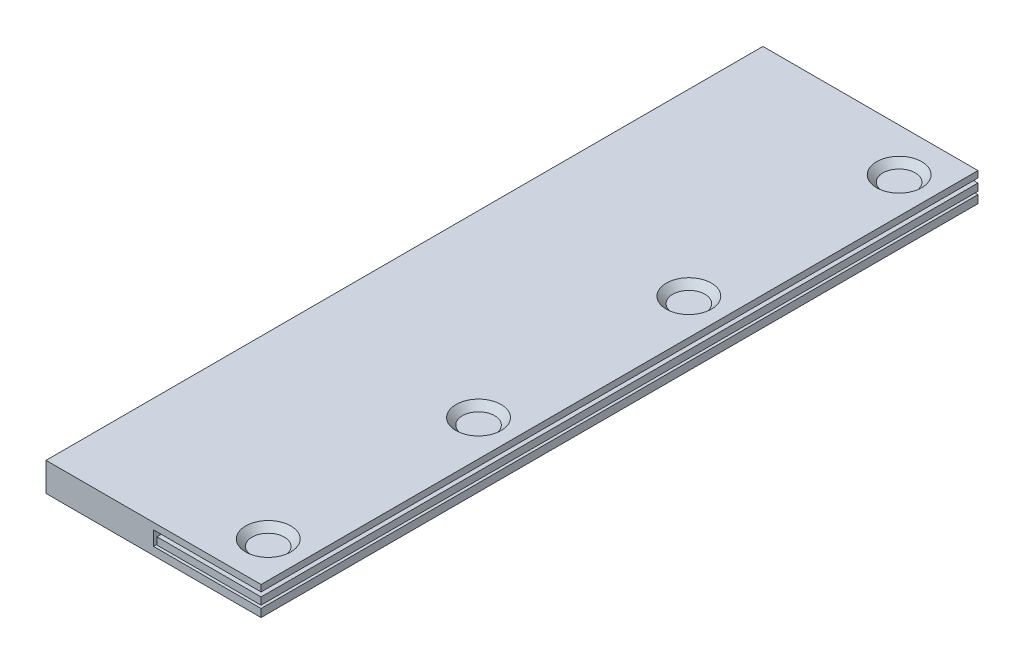
ISO-10303-21;
HEADER;
FILE_DESCRIPTION(('STEP AP214'),'2;1');
FILE_NAME('part.step','',(''),(''),'','','');
FILE_SCHEMA(('AUTOMOTIVE_DESIGN { 1 0 10303 214 1 1 1 1 }'));
ENDSEC;
DATA;
#1=APPLICATION_CONTEXT('core data for automotive mechanical design processes');
#2=APPLICATION_PROTOCOL_DEFINITION('international standard','automotive_design',2000,#1);
#3=PRODUCT_CONTEXT('',#1,'mechanical');
#4=PRODUCT('Part','Part','',(#3));
#5=PRODUCT_RELATED_PRODUCT_CATEGORY('part','',(#4));
#6=PRODUCT_DEFINITION_FORMATION('','',#4);
#7=PRODUCT_DEFINITION_CONTEXT('part definition',#1,'design');
#8=PRODUCT_DEFINITION('design','',#6,#7);
#9=PRODUCT_DEFINITION_SHAPE('','',#8);
#10=(LENGTH_UNIT() NAMED_UNIT(*) SI_UNIT(.MILLI.,.METRE.));
#11=(NAMED_UNIT(*) PLANE_ANGLE_UNIT() SI_UNIT($,.RADIAN.));
#12=(NAMED_UNIT(*) SI_UNIT($,.STERADIAN.) SOLID_ANGLE_UNIT());
#13=UNCERTAINTY_MEASURE_WITH_UNIT(LENGTH_MEASURE(1.E-05),#10,'distance_accuracy_value','');
#14=(GEOMETRIC_REPRESENTATION_CONTEXT(3) GLOBAL_UNCERTAINTY_ASSIGNED_CONTEXT((#13)) GLOBAL_UNIT_ASSIGNED_CONTEXT((#10,
#11,#12)) REPRESENTATION_CONTEXT('',''));
#15=CARTESIAN_POINT('',(0.,0.,0.));
#16=DIRECTION('',(0.,0.,1.));
#17=DIRECTION('',(1.,0.,0.));
#18=AXIS2_PLACEMENT_3D('',#15,#16,#17);
#19=CARTESIAN_POINT('',(0.,104.148653627844,0.));
#20=DIRECTION('',(-1.,0.,0.));
#21=DIRECTION('',(0.,-1.,0.));
#22=AXIS2_PLACEMENT_3D('',#19,#20,#21);
#23=PLANE('',#22);
#24=DIRECTION('',(0.,0.,-1.));
#25=VECTOR('',#24,1.);
#26=CARTESIAN_POINT('',(0.,2.5,0.));
#27=LINE('',#26,#25);
#28=CARTESIAN_POINT('',(0.,2.5,100.));
#29=VERTEX_POINT('',#28);
#30=CARTESIAN_POINT('',(0.,2.5,0.));
#31=VERTEX_POINT('',#30);
#32=EDGE_CURVE('E103',#29,#31,#27,.T.);
#33=ORIENTED_EDGE('',*,*,#32,.F.);
#34=DIRECTION('',(0.,-1.,0.));
#35=VECTOR('',#34,1.);
#36=CARTESIAN_POINT('',(0.,104.148653627844,100.));
#37=LINE('',#36,#35);
#38=CARTESIAN_POINT('',(0.,1.5,100.));
#39=VERTEX_POINT('',#38);
#40=EDGE_CURVE('E57',#29,#39,#37,.T.);
#41=ORIENTED_EDGE('',*,*,#40,.T.);
#42=DIRECTION('',(0.,0.,-1.));
#43=VECTOR('',#42,1.);
#44=CARTESIAN_POINT('',(0.,1.5,0.));
#45=LINE('',#44,#43);
#46=CARTESIAN_POINT('',(0.,1.5,0.));
#47=VERTEX_POINT('',#46);
#48=EDGE_CURVE('E101',#39,#47,#45,.T.);
#49=ORIENTED_EDGE('',*,*,#48,.T.);
#50=DIRECTION('',(0.,-1.,0.));
#51=VECTOR('',#50,1.);
#52=CARTESIAN_POINT('',(0.,104.148653627844,0.));
#53=LINE('',#52,#51);
#54=EDGE_CURVE('E92',#31,#47,#53,.T.);
#55=ORIENTED_EDGE('',*,*,#54,.F.);
#56=EDGE_LOOP('',(#33,#41,#49,#55));
#57=FACE_BOUND('',#56,.T.);
#58=ADVANCED_FACE('F53',(#57),#23,.F.);
#59=CARTESIAN_POINT('',(0.,104.148653627844,0.));
#60=DIRECTION('',(0.,0.,1.));
#61=DIRECTION('',(1.,0.,0.));
#62=AXIS2_PLACEMENT_3D('',#59,#60,#61);
#63=PLANE('',#62);
#64=DIRECTION('',(-1.,0.,0.));
#65=VECTOR('',#64,1.);
#66=CARTESIAN_POINT('',(0.,2.5,0.));
#67=LINE('',#66,#65);
#68=CARTESIAN_POINT('',(-14.52,2.5,0.));
#69=VERTEX_POINT('',#68);
#70=EDGE_CURVE('E62',#31,#69,#67,.T.);
#71=ORIENTED_EDGE('',*,*,#70,.F.);
#72=ORIENTED_EDGE('',*,*,#54,.T.);
#73=DIRECTION('',(-1.,0.,0.));
#74=VECTOR('',#73,1.);
#75=CARTESIAN_POINT('',(0.,1.5,0.));
#76=LINE('',#75,#74);
#77=CARTESIAN_POINT('',(-14.52,1.5,0.));
#78=VERTEX_POINT('',#77);
#79=EDGE_CURVE('E113',#47,#78,#76,.T.);
#80=ORIENTED_EDGE('',*,*,#79,.T.);
#81=DIRECTION('',(0.,-1.,0.));
#82=VECTOR('',#81,1.);
#83=CARTESIAN_POINT('',(-14.52,104.148653627844,0.));
#84=LINE('',#83,#82);
#85=EDGE_CURVE('E122',#69,#78,#84,.T.);
#86=ORIENTED_EDGE('',*,*,#85,.F.);
#87=EDGE_LOOP('',(#71,#72,#80,#86));
#88=FACE_BOUND('',#87,.T.);
#89=ADVANCED_FACE('F126',(#88),#63,.F.);
#90=CARTESIAN_POINT('',(-14.52,104.148653627844,0.));
#91=DIRECTION('',(1.,0.,0.));
#92=DIRECTION('',(0.,1.,0.));
#93=AXIS2_PLACEMENT_3D('',#90,#91,#92);
#94=PLANE('',#93);
#95=DIRECTION('',(0.,0.,1.));
#96=VECTOR('',#95,1.);
#97=CARTESIAN_POINT('',(-14.52,2.5,0.));
#98=LINE('',#97,#96);
#99=CARTESIAN_POINT('',(-14.52,2.5,100.));
#100=VERTEX_POINT('',#99);
#101=EDGE_CURVE('E13',#69,#100,#98,.T.);
#102=ORIENTED_EDGE('',*,*,#101,.F.);
#103=ORIENTED_EDGE('',*,*,#85,.T.);
#104=DIRECTION('',(0.,0.,1.));
#105=VECTOR('',#104,1.);
#106=CARTESIAN_POINT('',(-14.52,1.5,0.));
#107=LINE('',#106,#105);
#108=CARTESIAN_POINT('',(-14.52,1.5,100.));
#109=VERTEX_POINT('',#108);
#110=EDGE_CURVE('E123',#78,#109,#107,.T.);
#111=ORIENTED_EDGE('',*,*,#110,.T.);
#112=DIRECTION('',(0.,-1.,0.));
#113=VECTOR('',#112,1.);
#114=CARTESIAN_POINT('',(-14.52,104.148653627844,100.));
#115=LINE('',#114,#113);
#116=EDGE_CURVE('E75',#100,#109,#115,.T.);
#117=ORIENTED_EDGE('',*,*,#116,.F.);
#118=EDGE_LOOP('',(#102,#103,#111,#117));
#119=FACE_BOUND('',#118,.T.);
#120=ADVANCED_FACE('F125',(#119),#94,.F.);
#121=CARTESIAN_POINT('',(-14.52,104.148653627844,100.));
#122=DIRECTION('',(0.,0.,-1.));
#123=DIRECTION('',(-1.,0.,0.));
#124=AXIS2_PLACEMENT_3D('',#121,#122,#123);
#125=PLANE('',#124);
#126=DIRECTION('',(1.,0.,0.));
#127=VECTOR('',#126,1.);
#128=CARTESIAN_POINT('',(-14.52,2.5,100.));
#129=LINE('',#128,#127);
#130=EDGE_CURVE('E110',#100,#29,#129,.T.);
#131=ORIENTED_EDGE('',*,*,#130,.F.);
#132=ORIENTED_EDGE('',*,*,#116,.T.);
#133=DIRECTION('',(1.,0.,0.));
#134=VECTOR('',#133,1.);
#135=CARTESIAN_POINT('',(-14.52,1.5,100.));
#136=LINE('',#135,#134);
#137=EDGE_CURVE('E106',#109,#39,#136,.T.);
#138=ORIENTED_EDGE('',*,*,#137,.T.);
#139=ORIENTED_EDGE('',*,*,#40,.F.);
#140=EDGE_LOOP('',(#131,#132,#138,#139));
#141=FACE_BOUND('',#140,.T.);
#142=ADVANCED_FACE('F107',(#141),#125,.F.);
#143=CARTESIAN_POINT('',(0.,1.5,0.));
#144=DIRECTION('',(0.,1.,0.));
#145=DIRECTION('',(-1.,0.,0.));
#146=AXIS2_PLACEMENT_3D('',#143,#144,#145);
#147=PLANE('',#146);
#148=ORIENTED_EDGE('',*,*,#48,.F.);
#149=ORIENTED_EDGE('',*,*,#137,.F.);
#150=ORIENTED_EDGE('',*,*,#110,.F.);
#151=ORIENTED_EDGE('',*,*,#79,.F.);
#152=EDGE_LOOP('',(#148,#149,#150,#151));
#153=FACE_BOUND('',#152,.T.);
#154=ADVANCED_FACE('F112',(#153),#147,.F.);
#155=CARTESIAN_POINT('',(-15.,2.5,-15.0013332740793));
#156=DIRECTION('',(0.,1.,0.));
#157=DIRECTION('',(0.,0.,1.));
#158=AXIS2_PLACEMENT_3D('',#155,#156,#157);
#159=PLANE('',#158);
#160=ORIENTED_EDGE('',*,*,#130,.T.);
#161=ORIENTED_EDGE('',*,*,#32,.T.);
#162=ORIENTED_EDGE('',*,*,#70,.T.);
#163=ORIENTED_EDGE('',*,*,#101,.T.);
#164=EDGE_LOOP('',(#160,#161,#162,#163));
#165=FACE_BOUND('',#164,.T.);
#166=ADVANCED_FACE('F55',(#165),#159,.T.);
#167=CLOSED_SHELL('',(#58,#89,#120,#142,#154,#166));
#168=MANIFOLD_SOLID_BREP('B2',#167);
#169=CARTESIAN_POINT('',(-15.,3.1,-15.0013332740793));
#170=DIRECTION('',(0.,1.,0.));
#171=DIRECTION('',(0.,0.,1.));
#172=AXIS2_PLACEMENT_3D('',#169,#170,#171);
#173=PLANE('',#172);
#174=CARTESIAN_POINT('',(-5.,3.1,94.));
#175=DIRECTION('',(0.,1.,0.));
#176=DIRECTION('',(0.,0.,1.));
#177=AXIS2_PLACEMENT_3D('',#174,#175,#176);
#178=CIRCLE('',#177,2.25);
#179=CARTESIAN_POINT('',(-5.,3.1,96.25));
#180=VERTEX_POINT('',#179);
#181=EDGE_CURVE('E458',#180,#180,#178,.F.);
#182=ORIENTED_EDGE('',*,*,#181,.F.);
#183=EDGE_LOOP('',(#182));
#184=FACE_BOUND('',#183,.T.);
#185=DIRECTION('',(1.,0.,0.));
#186=VECTOR('',#185,1.);
#187=CARTESIAN_POINT('',(-15.,3.1,0.));
#188=LINE('',#187,#186);
#189=CARTESIAN_POINT('',(-15.,3.1,0.));
#190=VERTEX_POINT('',#189);
#191=CARTESIAN_POINT('',(0.,3.1,0.));
#192=VERTEX_POINT('',#191);
#193=EDGE_CURVE('E262',#190,#192,#188,.T.);
#194=ORIENTED_EDGE('',*,*,#193,.T.);
#195=DIRECTION('',(0.,0.,1.));
#196=VECTOR('',#195,1.);
#197=CARTESIAN_POINT('',(0.,3.1,-15.0013332740793));
#198=LINE('',#197,#196);
#199=CARTESIAN_POINT('',(0.,3.1,100.));
#200=VERTEX_POINT('',#199);
#201=EDGE_CURVE('E256',#192,#200,#198,.T.);
#202=ORIENTED_EDGE('',*,*,#201,.T.);
#203=DIRECTION('',(-1.,0.,0.));
#204=VECTOR('',#203,1.);
#205=CARTESIAN_POINT('',(-15.,3.1,100.));
#206=LINE('',#205,#204);
#207=CARTESIAN_POINT('',(-15.,3.1,100.));
#208=VERTEX_POINT('',#207);
#209=EDGE_CURVE('E260',#200,#208,#206,.T.);
#210=ORIENTED_EDGE('',*,*,#209,.T.);
#211=DIRECTION('',(0.,0.,1.));
#212=VECTOR('',#211,1.);
#213=CARTESIAN_POINT('',(-15.,3.1,-15.0013332740793));
#214=LINE('',#213,#212);
#215=EDGE_CURVE('E267',#190,#208,#214,.T.);
#216=ORIENTED_EDGE('',*,*,#215,.F.);
#217=EDGE_LOOP('',(#194,#202,#210,#216));
#218=FACE_BOUND('',#217,.T.);
#219=CARTESIAN_POINT('',(-5.,3.1,35.3333333333333));
#220=DIRECTION('',(0.,1.,0.));
#221=DIRECTION('',(0.,0.,1.));
#222=AXIS2_PLACEMENT_3D('',#219,#220,#221);
#223=CIRCLE('',#222,2.25);
#224=CARTESIAN_POINT('',(-5.,3.1,37.5833333333333));
#225=VERTEX_POINT('',#224);
#226=EDGE_CURVE('E278',#225,#225,#223,.F.);
#227=ORIENTED_EDGE('',*,*,#226,.F.);
#228=EDGE_LOOP('',(#227));
#229=FACE_BOUND('',#228,.T.);
#230=CARTESIAN_POINT('',(-5.,3.1,6.));
#231=DIRECTION('',(0.,1.,0.));
#232=DIRECTION('',(0.,0.,1.));
#233=AXIS2_PLACEMENT_3D('',#230,#231,#232);
#234=CIRCLE('',#233,2.25);
#235=CARTESIAN_POINT('',(-5.,3.1,8.25));
#236=VERTEX_POINT('',#235);
#237=EDGE_CURVE('E442',#236,#236,#234,.F.);
#238=ORIENTED_EDGE('',*,*,#237,.F.);
#239=EDGE_LOOP('',(#238));
#240=FACE_BOUND('',#239,.T.);
#241=CARTESIAN_POINT('',(-5.,3.1,64.6666666666667));
#242=DIRECTION('',(0.,1.,0.));
#243=DIRECTION('',(0.,0.,1.));
#244=AXIS2_PLACEMENT_3D('',#241,#242,#243);
#245=CIRCLE('',#244,2.25);
#246=CARTESIAN_POINT('',(-5.,3.1,66.9166666666667));
#247=VERTEX_POINT('',#246);
#248=EDGE_CURVE('E450',#247,#247,#245,.F.);
#249=ORIENTED_EDGE('',*,*,#248,.F.);
#250=EDGE_LOOP('',(#249));
#251=FACE_BOUND('',#250,.T.);
#252=ADVANCED_FACE('F178',(#184,#218,#229,#240,#251),#173,.F.);
#253=CARTESIAN_POINT('',(0.,4.,0.));
#254=DIRECTION('',(-1.,0.,0.));
#255=DIRECTION('',(0.,0.,1.));
#256=AXIS2_PLACEMENT_3D('',#253,#254,#255);
#257=PLANE('',#256);
#258=DIRECTION('',(0.,-1.,0.));
#259=VECTOR('',#258,1.);
#260=CARTESIAN_POINT('',(0.,4.,0.));
#261=LINE('',#260,#259);
#262=CARTESIAN_POINT('',(0.,1.1,0.));
#263=VERTEX_POINT('',#262);
#264=CARTESIAN_POINT('',(0.,0.,0.));
#265=VERTEX_POINT('',#264);
#266=EDGE_CURVE('E188',#263,#265,#261,.T.);
#267=ORIENTED_EDGE('',*,*,#266,.F.);
#268=DIRECTION('',(0.,0.,1.));
#269=VECTOR('',#268,1.);
#270=CARTESIAN_POINT('',(0.,1.1,-0.001000000000001));
#271=LINE('',#270,#269);
#272=CARTESIAN_POINT('',(0.,1.1,100.));
#273=VERTEX_POINT('',#272);
#274=EDGE_CURVE('E311',#263,#273,#271,.T.);
#275=ORIENTED_EDGE('',*,*,#274,.T.);
#276=DIRECTION('',(0.,-1.,0.));
#277=VECTOR('',#276,1.);
#278=CARTESIAN_POINT('',(0.,4.,100.));
#279=LINE('',#278,#277);
#280=CARTESIAN_POINT('',(0.,0.,100.));
#281=VERTEX_POINT('',#280);
#282=EDGE_CURVE('E222',#273,#281,#279,.T.);
#283=ORIENTED_EDGE('',*,*,#282,.T.);
#284=DIRECTION('',(0.,0.,-1.));
#285=VECTOR('',#284,1.);
#286=CARTESIAN_POINT('',(0.,0.,0.));
#287=LINE('',#286,#285);
#288=EDGE_CURVE('E306',#281,#265,#287,.T.);
#289=ORIENTED_EDGE('',*,*,#288,.T.);
#290=EDGE_LOOP('',(#267,#275,#283,#289));
#291=FACE_BOUND('',#290,.T.);
#292=ADVANCED_FACE('F309',(#291),#257,.F.);
#293=CARTESIAN_POINT('',(0.,4.,100.));
#294=VERTEX_POINT('',#293);
#295=EDGE_CURVE('E271',#294,#200,#279,.T.);
#296=ORIENTED_EDGE('',*,*,#295,.T.);
#297=ORIENTED_EDGE('',*,*,#201,.F.);
#298=CARTESIAN_POINT('',(0.,4.,0.));
#299=VERTEX_POINT('',#298);
#300=EDGE_CURVE('E51',#299,#192,#261,.T.);
#301=ORIENTED_EDGE('',*,*,#300,.F.);
#302=DIRECTION('',(0.,0.,-1.));
#303=VECTOR('',#302,1.);
#304=CARTESIAN_POINT('',(0.,4.,0.));
#305=LINE('',#304,#303);
#306=EDGE_CURVE('E280',#294,#299,#305,.T.);
#307=ORIENTED_EDGE('',*,*,#306,.F.);
#308=EDGE_LOOP('',(#296,#297,#301,#307));
#309=FACE_BOUND('',#308,.T.);
#310=ADVANCED_FACE('F180',(#309),#257,.F.);
#311=CARTESIAN_POINT('',(0.,4.,0.));
#312=DIRECTION('',(0.,0.,1.));
#313=DIRECTION('',(1.,0.,0.));
#314=AXIS2_PLACEMENT_3D('',#311,#312,#313);
#315=PLANE('',#314);
#316=ORIENTED_EDGE('',*,*,#193,.F.);
#317=DIRECTION('',(0.,1.,0.));
#318=VECTOR('',#317,1.);
#319=CARTESIAN_POINT('',(-15.,2.9,0.));
#320=LINE('',#319,#318);
#321=CARTESIAN_POINT('',(-15.,1.1,0.));
#322=VERTEX_POINT('',#321);
#323=EDGE_CURVE('E418',#322,#190,#320,.T.);
#324=ORIENTED_EDGE('',*,*,#323,.F.);
#325=DIRECTION('',(-1.,0.,0.));
#326=VECTOR('',#325,1.);
#327=CARTESIAN_POINT('',(0.,1.1,0.));
#328=LINE('',#327,#326);
#329=EDGE_CURVE('E301',#263,#322,#328,.T.);
#330=ORIENTED_EDGE('',*,*,#329,.F.);
#331=ORIENTED_EDGE('',*,*,#266,.T.);
#332=DIRECTION('',(-1.,0.,0.));
#333=VECTOR('',#332,1.);
#334=CARTESIAN_POINT('',(0.,0.,0.));
#335=LINE('',#334,#333);
#336=CARTESIAN_POINT('',(-30.,0.,0.));
#337=VERTEX_POINT('',#336);
#338=EDGE_CURVE('E298',#265,#337,#335,.T.);
#339=ORIENTED_EDGE('',*,*,#338,.T.);
#340=DIRECTION('',(0.,-1.,0.));
#341=VECTOR('',#340,1.);
#342=CARTESIAN_POINT('',(-30.,4.,0.));
#343=LINE('',#342,#341);
#344=CARTESIAN_POINT('',(-30.,4.,0.));
#345=VERTEX_POINT('',#344);
#346=EDGE_CURVE('E286',#345,#337,#343,.T.);
#347=ORIENTED_EDGE('',*,*,#346,.F.);
#348=DIRECTION('',(-1.,0.,0.));
#349=VECTOR('',#348,1.);
#350=CARTESIAN_POINT('',(0.,4.,0.));
#351=LINE('',#350,#349);
#352=EDGE_CURVE('E229',#299,#345,#351,.T.);
#353=ORIENTED_EDGE('',*,*,#352,.F.);
#354=ORIENTED_EDGE('',*,*,#300,.T.);
#355=EDGE_LOOP('',(#316,#324,#330,#331,#339,#347,#353,#354));
#356=FACE_BOUND('',#355,.T.);
#357=ADVANCED_FACE('F297',(#356),#315,.F.);
#358=CARTESIAN_POINT('',(-30.,4.,0.));
#359=DIRECTION('',(1.,0.,0.));
#360=DIRECTION('',(0.,0.,-1.));
#361=AXIS2_PLACEMENT_3D('',#358,#359,#360);
#362=PLANE('',#361);
#363=DIRECTION('',(0.,0.,1.));
#364=VECTOR('',#363,1.);
#365=CARTESIAN_POINT('',(-30.,0.,0.));
#366=LINE('',#365,#364);
#367=CARTESIAN_POINT('',(-30.,0.,100.));
#368=VERTEX_POINT('',#367);
#369=EDGE_CURVE('E214',#337,#368,#366,.T.);
#370=ORIENTED_EDGE('',*,*,#369,.T.);
#371=DIRECTION('',(0.,-1.,0.));
#372=VECTOR('',#371,1.);
#373=CARTESIAN_POINT('',(-30.,4.,100.));
#374=LINE('',#373,#372);
#375=CARTESIAN_POINT('',(-30.,4.,100.));
#376=VERTEX_POINT('',#375);
#377=EDGE_CURVE('E282',#376,#368,#374,.T.);
#378=ORIENTED_EDGE('',*,*,#377,.F.);
#379=DIRECTION('',(0.,0.,1.));
#380=VECTOR('',#379,1.);
#381=CARTESIAN_POINT('',(-30.,4.,0.));
#382=LINE('',#381,#380);
#383=EDGE_CURVE('E323',#345,#376,#382,.T.);
#384=ORIENTED_EDGE('',*,*,#383,.F.);
#385=ORIENTED_EDGE('',*,*,#346,.T.);
#386=EDGE_LOOP('',(#370,#378,#384,#385));
#387=FACE_BOUND('',#386,.T.);
#388=ADVANCED_FACE('F329',(#387),#362,.F.);
#389=CARTESIAN_POINT('',(0.,4.,100.));
#390=DIRECTION('',(0.,0.,-1.));
#391=DIRECTION('',(-1.,0.,0.));
#392=AXIS2_PLACEMENT_3D('',#389,#390,#391);
#393=PLANE('',#392);
#394=DIRECTION('',(0.,-1.,0.));
#395=VECTOR('',#394,1.);
#396=CARTESIAN_POINT('',(-15.,2.9,100.));
#397=LINE('',#396,#395);
#398=CARTESIAN_POINT('',(-15.,1.1,100.));
#399=VERTEX_POINT('',#398);
#400=EDGE_CURVE('E275',#208,#399,#397,.T.);
#401=ORIENTED_EDGE('',*,*,#400,.F.);
#402=ORIENTED_EDGE('',*,*,#209,.F.);
#403=ORIENTED_EDGE('',*,*,#295,.F.);
#404=DIRECTION('',(1.,0.,0.));
#405=VECTOR('',#404,1.);
#406=CARTESIAN_POINT('',(0.,4.,100.));
#407=LINE('',#406,#405);
#408=EDGE_CURVE('E196',#376,#294,#407,.T.);
#409=ORIENTED_EDGE('',*,*,#408,.F.);
#410=ORIENTED_EDGE('',*,*,#377,.T.);
#411=DIRECTION('',(1.,0.,0.));
#412=VECTOR('',#411,1.);
#413=CARTESIAN_POINT('',(0.,0.,100.));
#414=LINE('',#413,#412);
#415=EDGE_CURVE('E289',#368,#281,#414,.T.);
#416=ORIENTED_EDGE('',*,*,#415,.T.);
#417=ORIENTED_EDGE('',*,*,#282,.F.);
#418=DIRECTION('',(1.,0.,0.));
#419=VECTOR('',#418,1.);
#420=CARTESIAN_POINT('',(0.,1.1,100.));
#421=LINE('',#420,#419);
#422=EDGE_CURVE('E425',#399,#273,#421,.T.);
#423=ORIENTED_EDGE('',*,*,#422,.F.);
#424=EDGE_LOOP('',(#401,#402,#403,#409,#410,#416,#417,#423));
#425=FACE_BOUND('',#424,.T.);
#426=ADVANCED_FACE('F270',(#425),#393,.F.);
#427=CARTESIAN_POINT('',(0.,4.,0.));
#428=DIRECTION('',(0.,-1.,0.));
#429=DIRECTION('',(0.,0.,-1.));
#430=AXIS2_PLACEMENT_3D('',#427,#428,#429);
#431=PLANE('',#430);
#432=CARTESIAN_POINT('',(-5.,4.,94.));
#433=DIRECTION('',(0.,1.,0.));
#434=DIRECTION('',(0.,0.,1.));
#435=AXIS2_PLACEMENT_3D('',#432,#433,#434);
#436=CIRCLE('',#435,3.15);
#437=CARTESIAN_POINT('',(-5.,4.,97.15));
#438=VERTEX_POINT('',#437);
#439=EDGE_CURVE('E462',#438,#438,#436,.T.);
#440=ORIENTED_EDGE('',*,*,#439,.F.);
#441=EDGE_LOOP('',(#440));
#442=FACE_BOUND('',#441,.T.);
#443=CARTESIAN_POINT('',(-5.,4.,64.6666666666667));
#444=DIRECTION('',(0.,1.,0.));
#445=DIRECTION('',(0.,0.,1.));
#446=AXIS2_PLACEMENT_3D('',#443,#444,#445);
#447=CIRCLE('',#446,3.15);
#448=CARTESIAN_POINT('',(-5.,4.,67.8166666666667));
#449=VERTEX_POINT('',#448);
#450=EDGE_CURVE('E454',#449,#449,#447,.T.);
#451=ORIENTED_EDGE('',*,*,#450,.F.);
#452=EDGE_LOOP('',(#451));
#453=FACE_BOUND('',#452,.T.);
#454=CARTESIAN_POINT('',(-5.,4.,6.));
#455=DIRECTION('',(0.,1.,0.));
#456=DIRECTION('',(0.,0.,1.));
#457=AXIS2_PLACEMENT_3D('',#454,#455,#456);
#458=CIRCLE('',#457,3.15);
#459=CARTESIAN_POINT('',(-5.,4.,9.15));
#460=VERTEX_POINT('',#459);
#461=EDGE_CURVE('E446',#460,#460,#458,.T.);
#462=ORIENTED_EDGE('',*,*,#461,.F.);
#463=EDGE_LOOP('',(#462));
#464=FACE_BOUND('',#463,.T.);
#465=CARTESIAN_POINT('',(-5.,4.,35.3333333333333));
#466=DIRECTION('',(0.,1.,0.));
#467=DIRECTION('',(0.,0.,1.));
#468=AXIS2_PLACEMENT_3D('',#465,#466,#467);
#469=CIRCLE('',#468,3.15);
#470=CARTESIAN_POINT('',(-5.,4.,38.4833333333333));
#471=VERTEX_POINT('',#470);
#472=EDGE_CURVE('E438',#471,#471,#469,.T.);
#473=ORIENTED_EDGE('',*,*,#472,.F.);
#474=EDGE_LOOP('',(#473));
#475=FACE_BOUND('',#474,.T.);
#476=ORIENTED_EDGE('',*,*,#306,.T.);
#477=ORIENTED_EDGE('',*,*,#352,.T.);
#478=ORIENTED_EDGE('',*,*,#383,.T.);
#479=ORIENTED_EDGE('',*,*,#408,.T.);
#480=EDGE_LOOP('',(#476,#477,#478,#479));
#481=FACE_BOUND('',#480,.T.);
#482=ADVANCED_FACE('F328',(#442,#453,#464,#475,#481),#431,.F.);
#483=CARTESIAN_POINT('',(0.,0.,0.));
#484=DIRECTION('',(0.,-1.,0.));
#485=DIRECTION('',(0.,0.,-1.));
#486=AXIS2_PLACEMENT_3D('',#483,#484,#485);
#487=PLANE('',#486);
#488=CARTESIAN_POINT('',(-5.,0.,6.));
#489=DIRECTION('',(0.,1.,0.));
#490=DIRECTION('',(0.,0.,1.));
#491=AXIS2_PLACEMENT_3D('',#488,#489,#490);
#492=CIRCLE('',#491,1.55);
#493=CARTESIAN_POINT('',(-5.,0.,7.55));
#494=VERTEX_POINT('',#493);
#495=EDGE_CURVE('E382',#494,#494,#492,.T.);
#496=ORIENTED_EDGE('',*,*,#495,.T.);
#497=EDGE_LOOP('',(#496));
#498=FACE_BOUND('',#497,.T.);
#499=CARTESIAN_POINT('',(-5.,0.,35.3333333333333));
#500=DIRECTION('',(0.,1.,0.));
#501=DIRECTION('',(0.,0.,1.));
#502=AXIS2_PLACEMENT_3D('',#499,#500,#501);
#503=CIRCLE('',#502,1.55);
#504=CARTESIAN_POINT('',(-5.,0.,36.8833333333333));
#505=VERTEX_POINT('',#504);
#506=EDGE_CURVE('E386',#505,#505,#503,.T.);
#507=ORIENTED_EDGE('',*,*,#506,.T.);
#508=EDGE_LOOP('',(#507));
#509=FACE_BOUND('',#508,.T.);
#510=CARTESIAN_POINT('',(-5.,0.,94.));
#511=DIRECTION('',(0.,1.,0.));
#512=DIRECTION('',(0.,0.,1.));
#513=AXIS2_PLACEMENT_3D('',#510,#511,#512);
#514=CIRCLE('',#513,1.55);
#515=CARTESIAN_POINT('',(-5.,0.,95.55));
#516=VERTEX_POINT('',#515);
#517=EDGE_CURVE('E390',#516,#516,#514,.T.);
#518=ORIENTED_EDGE('',*,*,#517,.T.);
#519=EDGE_LOOP('',(#518));
#520=FACE_BOUND('',#519,.T.);
#521=CARTESIAN_POINT('',(-5.,0.,64.6666666666667));
#522=DIRECTION('',(0.,1.,0.));
#523=DIRECTION('',(0.,0.,-1.));
#524=AXIS2_PLACEMENT_3D('',#521,#522,#523);
#525=CIRCLE('',#524,1.55);
#526=CARTESIAN_POINT('',(-5.,0.,63.1166666666667));
#527=VERTEX_POINT('',#526);
#528=EDGE_CURVE('E393',#527,#527,#525,.T.);
#529=ORIENTED_EDGE('',*,*,#528,.T.);
#530=EDGE_LOOP('',(#529));
#531=FACE_BOUND('',#530,.T.);
#532=ORIENTED_EDGE('',*,*,#288,.F.);
#533=ORIENTED_EDGE('',*,*,#415,.F.);
#534=ORIENTED_EDGE('',*,*,#369,.F.);
#535=ORIENTED_EDGE('',*,*,#338,.F.);
#536=EDGE_LOOP('',(#532,#533,#534,#535));
#537=FACE_BOUND('',#536,.T.);
#538=ADVANCED_FACE('F304',(#498,#509,#520,#531,#537),#487,.T.);
#539=CARTESIAN_POINT('',(0.,1.1,-0.001000000000001));
#540=DIRECTION('',(0.,-1.,0.));
#541=DIRECTION('',(1.,0.,0.));
#542=AXIS2_PLACEMENT_3D('',#539,#540,#541);
#543=PLANE('',#542);
#544=CARTESIAN_POINT('',(-5.,1.1,6.));
#545=DIRECTION('',(0.,-1.,0.));
#546=DIRECTION('',(1.,0.,0.));
#547=AXIS2_PLACEMENT_3D('',#544,#545,#546);
#548=CIRCLE('',#547,1.55);
#549=CARTESIAN_POINT('',(-3.45,1.1,6.));
#550=VERTEX_POINT('',#549);
#551=EDGE_CURVE('E414',#550,#550,#548,.T.);
#552=ORIENTED_EDGE('',*,*,#551,.T.);
#553=EDGE_LOOP('',(#552));
#554=FACE_BOUND('',#553,.T.);
#555=CARTESIAN_POINT('',(-5.,1.1,35.3333333333333));
#556=DIRECTION('',(0.,-1.,0.));
#557=DIRECTION('',(1.,0.,0.));
#558=AXIS2_PLACEMENT_3D('',#555,#556,#557);
#559=CIRCLE('',#558,1.55);
#560=CARTESIAN_POINT('',(-3.45,1.1,35.3333333333333));
#561=VERTEX_POINT('',#560);
#562=EDGE_CURVE('E410',#561,#561,#559,.T.);
#563=ORIENTED_EDGE('',*,*,#562,.T.);
#564=EDGE_LOOP('',(#563));
#565=FACE_BOUND('',#564,.T.);
#566=CARTESIAN_POINT('',(-5.,1.1,94.));
#567=DIRECTION('',(0.,-1.,0.));
#568=DIRECTION('',(1.,0.,0.));
#569=AXIS2_PLACEMENT_3D('',#566,#567,#568);
#570=CIRCLE('',#569,1.55);
#571=CARTESIAN_POINT('',(-3.45,1.1,94.));
#572=VERTEX_POINT('',#571);
#573=EDGE_CURVE('E406',#572,#572,#570,.T.);
#574=ORIENTED_EDGE('',*,*,#573,.T.);
#575=EDGE_LOOP('',(#574));
#576=FACE_BOUND('',#575,.T.);
#577=CARTESIAN_POINT('',(-5.,1.1,64.6666666666667));
#578=DIRECTION('',(0.,-1.,0.));
#579=DIRECTION('',(1.,0.,0.));
#580=AXIS2_PLACEMENT_3D('',#577,#578,#579);
#581=CIRCLE('',#580,1.55);
#582=CARTESIAN_POINT('',(-3.45,1.1,64.6666666666667));
#583=VERTEX_POINT('',#582);
#584=EDGE_CURVE('E402',#583,#583,#581,.T.);
#585=ORIENTED_EDGE('',*,*,#584,.T.);
#586=EDGE_LOOP('',(#585));
#587=FACE_BOUND('',#586,.T.);
#588=ORIENTED_EDGE('',*,*,#329,.T.);
#589=DIRECTION('',(0.,0.,1.));
#590=VECTOR('',#589,1.);
#591=CARTESIAN_POINT('',(-15.,1.1,-0.001000000000001));
#592=LINE('',#591,#590);
#593=EDGE_CURVE('E314',#322,#399,#592,.T.);
#594=ORIENTED_EDGE('',*,*,#593,.T.);
#595=ORIENTED_EDGE('',*,*,#422,.T.);
#596=ORIENTED_EDGE('',*,*,#274,.F.);
#597=EDGE_LOOP('',(#588,#594,#595,#596));
#598=FACE_BOUND('',#597,.T.);
#599=ADVANCED_FACE('F365',(#554,#565,#576,#587,#598),#543,.F.);
#600=CARTESIAN_POINT('',(-15.,2.9,-0.001000000000001));
#601=DIRECTION('',(-1.,0.,0.));
#602=DIRECTION('',(0.,0.,1.));
#603=AXIS2_PLACEMENT_3D('',#600,#601,#602);
#604=PLANE('',#603);
#605=ORIENTED_EDGE('',*,*,#323,.T.);
#606=ORIENTED_EDGE('',*,*,#215,.T.);
#607=ORIENTED_EDGE('',*,*,#400,.T.);
#608=ORIENTED_EDGE('',*,*,#593,.F.);
#609=EDGE_LOOP('',(#605,#606,#607,#608));
#610=FACE_BOUND('',#609,.T.);
#611=ADVANCED_FACE('F363',(#610),#604,.F.);
#612=CARTESIAN_POINT('',(-5.,0.,64.6666666666667));
#613=DIRECTION('',(0.,1.,0.));
#614=DIRECTION('',(0.,0.,1.));
#615=AXIS2_PLACEMENT_3D('',#612,#613,#614);
#616=CYLINDRICAL_SURFACE('',#615,1.55);
#617=ORIENTED_EDGE('',*,*,#528,.F.);
#618=EDGE_LOOP('',(#617));
#619=FACE_BOUND('',#618,.T.);
#620=ORIENTED_EDGE('',*,*,#584,.F.);
#621=EDGE_LOOP('',(#620));
#622=FACE_BOUND('',#621,.T.);
#623=ADVANCED_FACE('F359',(#619,#622),#616,.F.);
#624=CARTESIAN_POINT('',(-5.,0.,94.));
#625=DIRECTION('',(0.,1.,0.));
#626=DIRECTION('',(0.,0.,1.));
#627=AXIS2_PLACEMENT_3D('',#624,#625,#626);
#628=CYLINDRICAL_SURFACE('',#627,1.55);
#629=ORIENTED_EDGE('',*,*,#517,.F.);
#630=EDGE_LOOP('',(#629));
#631=FACE_BOUND('',#630,.T.);
#632=ORIENTED_EDGE('',*,*,#573,.F.);
#633=EDGE_LOOP('',(#632));
#634=FACE_BOUND('',#633,.T.);
#635=ADVANCED_FACE('F355',(#631,#634),#628,.F.);
#636=CARTESIAN_POINT('',(-5.,0.,35.3333333333333));
#637=DIRECTION('',(0.,1.,0.));
#638=DIRECTION('',(0.,0.,1.));
#639=AXIS2_PLACEMENT_3D('',#636,#637,#638);
#640=CYLINDRICAL_SURFACE('',#639,1.55);
#641=ORIENTED_EDGE('',*,*,#506,.F.);
#642=EDGE_LOOP('',(#641));
#643=FACE_BOUND('',#642,.T.);
#644=ORIENTED_EDGE('',*,*,#562,.F.);
#645=EDGE_LOOP('',(#644));
#646=FACE_BOUND('',#645,.T.);
#647=ADVANCED_FACE('F351',(#643,#646),#640,.F.);
#648=CARTESIAN_POINT('',(-5.,0.,6.));
#649=DIRECTION('',(0.,1.,0.));
#650=DIRECTION('',(0.,0.,1.));
#651=AXIS2_PLACEMENT_3D('',#648,#649,#650);
#652=CYLINDRICAL_SURFACE('',#651,1.55);
#653=ORIENTED_EDGE('',*,*,#495,.F.);
#654=EDGE_LOOP('',(#653));
#655=FACE_BOUND('',#654,.T.);
#656=ORIENTED_EDGE('',*,*,#551,.F.);
#657=EDGE_LOOP('',(#656));
#658=FACE_BOUND('',#657,.T.);
#659=ADVANCED_FACE('F348',(#655,#658),#652,.F.);
#660=CARTESIAN_POINT('',(-5.,4.,35.3333333333333));
#661=DIRECTION('',(0.,1.,0.));
#662=DIRECTION('',(0.,0.,1.));
#663=AXIS2_PLACEMENT_3D('',#660,#661,#662);
#664=CONICAL_SURFACE('',#663,3.15,0.785398163397448);
#665=ORIENTED_EDGE('',*,*,#226,.T.);
#666=EDGE_LOOP('',(#665));
#667=FACE_BOUND('',#666,.T.);
#668=ORIENTED_EDGE('',*,*,#472,.T.);
#669=EDGE_LOOP('',(#668));
#670=FACE_BOUND('',#669,.T.);
#671=ADVANCED_FACE('F346',(#667,#670),#664,.F.);
#672=CARTESIAN_POINT('',(-5.,4.,6.));
#673=DIRECTION('',(0.,1.,0.));
#674=DIRECTION('',(0.,0.,1.));
#675=AXIS2_PLACEMENT_3D('',#672,#673,#674);
#676=CONICAL_SURFACE('',#675,3.15,0.785398163397448);
#677=ORIENTED_EDGE('',*,*,#237,.T.);
#678=EDGE_LOOP('',(#677));
#679=FACE_BOUND('',#678,.T.);
#680=ORIENTED_EDGE('',*,*,#461,.T.);
#681=EDGE_LOOP('',(#680));
#682=FACE_BOUND('',#681,.T.);
#683=ADVANCED_FACE('F476',(#679,#682),#676,.F.);
#684=CARTESIAN_POINT('',(-5.,4.,64.6666666666667));
#685=DIRECTION('',(0.,1.,0.));
#686=DIRECTION('',(0.,0.,1.));
#687=AXIS2_PLACEMENT_3D('',#684,#685,#686);
#688=CONICAL_SURFACE('',#687,3.15,0.785398163397448);
#689=ORIENTED_EDGE('',*,*,#248,.T.);
#690=EDGE_LOOP('',(#689));
#691=FACE_BOUND('',#690,.T.);
#692=ORIENTED_EDGE('',*,*,#450,.T.);
#693=EDGE_LOOP('',(#692));
#694=FACE_BOUND('',#693,.T.);
#695=ADVANCED_FACE('F481',(#691,#694),#688,.F.);
#696=CARTESIAN_POINT('',(-5.,4.,94.));
#697=DIRECTION('',(0.,1.,0.));
#698=DIRECTION('',(0.,0.,1.));
#699=AXIS2_PLACEMENT_3D('',#696,#697,#698);
#700=CONICAL_SURFACE('',#699,3.15,0.785398163397448);
#701=ORIENTED_EDGE('',*,*,#181,.T.);
#702=EDGE_LOOP('',(#701));
#703=FACE_BOUND('',#702,.T.);
#704=ORIENTED_EDGE('',*,*,#439,.T.);
#705=EDGE_LOOP('',(#704));
#706=FACE_BOUND('',#705,.T.);
#707=ADVANCED_FACE('F467',(#703,#706),#700,.F.);
#708=CLOSED_SHELL('',(#252,#292,#310,#357,#388,#426,#482,#538,#599,#611,#623,#635,#647,#659,
#671,#683,#695,#707));
#709=MANIFOLD_SOLID_BREP('B7',#708);
#710=ADVANCED_BREP_SHAPE_REPRESENTATION('',(#18,#168,#709),#14);
#711=SHAPE_DEFINITION_REPRESENTATION(#9,#710);
ENDSEC;
END-ISO-10303-21;
